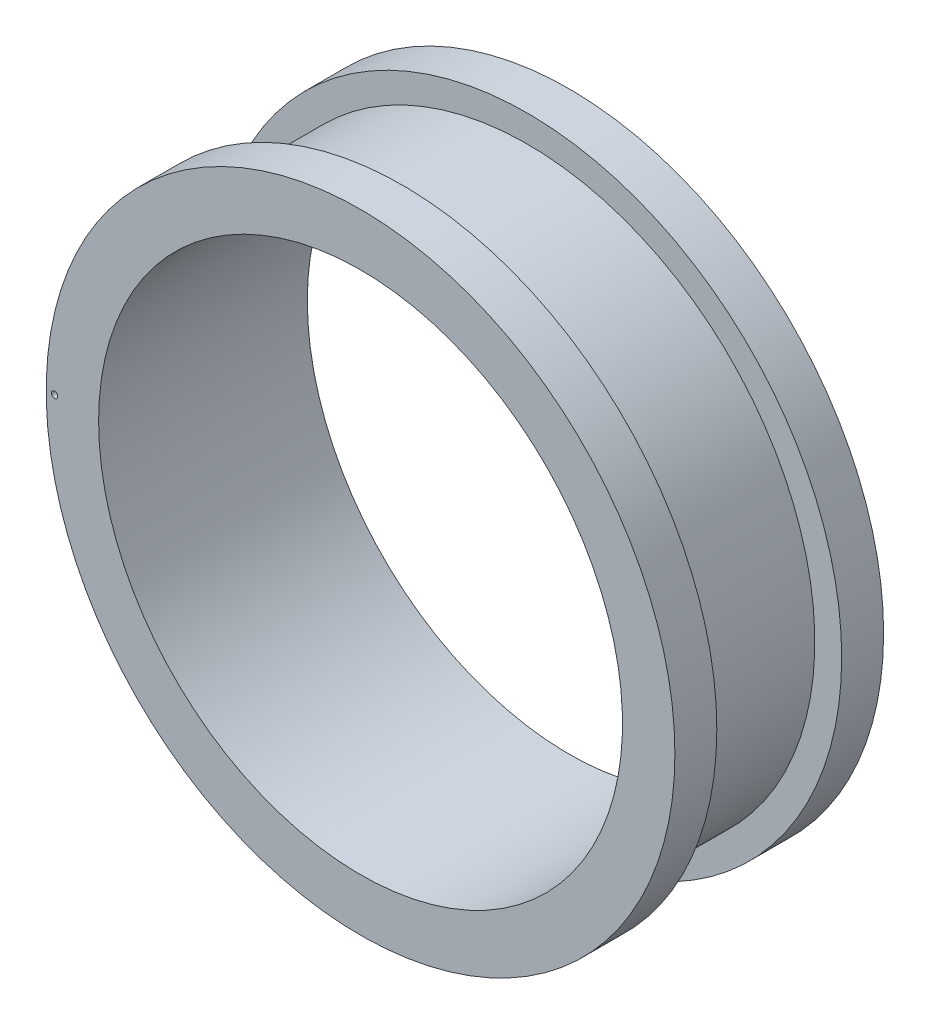
ISO-10303-21;
HEADER;
FILE_DESCRIPTION(('STEP AP214'),'2;1');
FILE_NAME('part.step','',(''),(''),'','','');
FILE_SCHEMA(('AUTOMOTIVE_DESIGN { 1 0 10303 214 1 1 1 1 }'));
ENDSEC;
DATA;
#1=APPLICATION_CONTEXT('core data for automotive mechanical design processes');
#2=APPLICATION_PROTOCOL_DEFINITION('international standard','automotive_design',2000,#1);
#3=PRODUCT_CONTEXT('',#1,'mechanical');
#4=PRODUCT('Part','Part','',(#3));
#5=PRODUCT_RELATED_PRODUCT_CATEGORY('part','',(#4));
#6=PRODUCT_DEFINITION_FORMATION('','',#4);
#7=PRODUCT_DEFINITION_CONTEXT('part definition',#1,'design');
#8=PRODUCT_DEFINITION('design','',#6,#7);
#9=PRODUCT_DEFINITION_SHAPE('','',#8);
#10=(LENGTH_UNIT() NAMED_UNIT(*) SI_UNIT(.MILLI.,.METRE.));
#11=(NAMED_UNIT(*) PLANE_ANGLE_UNIT() SI_UNIT($,.RADIAN.));
#12=(NAMED_UNIT(*) SI_UNIT($,.STERADIAN.) SOLID_ANGLE_UNIT());
#13=UNCERTAINTY_MEASURE_WITH_UNIT(LENGTH_MEASURE(1.E-05),#10,'distance_accuracy_value','');
#14=(GEOMETRIC_REPRESENTATION_CONTEXT(3) GLOBAL_UNCERTAINTY_ASSIGNED_CONTEXT((#13)) GLOBAL_UNIT_ASSIGNED_CONTEXT((#10,
#11,#12)) REPRESENTATION_CONTEXT('',''));
#15=CARTESIAN_POINT('',(0.,0.,0.));
#16=DIRECTION('',(0.,0.,1.));
#17=DIRECTION('',(1.,0.,0.));
#18=AXIS2_PLACEMENT_3D('',#15,#16,#17);
#19=CARTESIAN_POINT('',(0.,0.,-20.));
#20=DIRECTION('',(0.,0.,1.));
#21=DIRECTION('',(1.,0.,0.));
#22=AXIS2_PLACEMENT_3D('',#19,#20,#21);
#23=CYLINDRICAL_SURFACE('',#22,150.);
#24=CARTESIAN_POINT('',(0.,0.,-20.));
#25=DIRECTION('',(0.,0.,1.));
#26=DIRECTION('',(1.,0.,0.));
#27=AXIS2_PLACEMENT_3D('',#24,#25,#26);
#28=CIRCLE('',#27,150.);
#29=CARTESIAN_POINT('',(150.,0.,-20.));
#30=VERTEX_POINT('',#29);
#31=EDGE_CURVE('E42',#30,#30,#28,.T.);
#32=ORIENTED_EDGE('',*,*,#31,.T.);
#33=EDGE_LOOP('',(#32));
#34=FACE_BOUND('',#33,.T.);
#35=CARTESIAN_POINT('',(0.,0.,0.));
#36=DIRECTION('',(0.,0.,1.));
#37=DIRECTION('',(1.,0.,0.));
#38=AXIS2_PLACEMENT_3D('',#35,#36,#37);
#39=CIRCLE('',#38,150.);
#40=CARTESIAN_POINT('',(150.,0.,0.));
#41=VERTEX_POINT('',#40);
#42=EDGE_CURVE('E37',#41,#41,#39,.T.);
#43=ORIENTED_EDGE('',*,*,#42,.F.);
#44=EDGE_LOOP('',(#43));
#45=FACE_BOUND('',#44,.T.);
#46=ADVANCED_FACE('F40',(#34,#45),#23,.T.);
#47=CARTESIAN_POINT('',(0.,0.,-20.));
#48=DIRECTION('',(0.,0.,1.));
#49=DIRECTION('',(1.,0.,0.));
#50=AXIS2_PLACEMENT_3D('',#47,#48,#49);
#51=PLANE('',#50);
#52=CARTESIAN_POINT('',(0.,0.,-20.));
#53=DIRECTION('',(0.,0.,-1.));
#54=DIRECTION('',(-1.,0.,0.));
#55=AXIS2_PLACEMENT_3D('',#52,#53,#54);
#56=CIRCLE('',#55,125.);
#57=CARTESIAN_POINT('',(-125.,0.,-20.));
#58=VERTEX_POINT('',#57);
#59=EDGE_CURVE('E52',#58,#58,#56,.T.);
#60=ORIENTED_EDGE('',*,*,#59,.F.);
#61=EDGE_LOOP('',(#60));
#62=FACE_BOUND('',#61,.T.);
#63=ORIENTED_EDGE('',*,*,#31,.F.);
#64=EDGE_LOOP('',(#63));
#65=FACE_BOUND('',#64,.T.);
#66=ADVANCED_FACE('F105',(#62,#65),#51,.F.);
#67=CARTESIAN_POINT('',(0.,0.,0.));
#68=DIRECTION('',(0.,0.,1.));
#69=DIRECTION('',(1.,0.,0.));
#70=AXIS2_PLACEMENT_3D('',#67,#68,#69);
#71=PLANE('',#70);
#72=CARTESIAN_POINT('',(0.,0.,0.));
#73=DIRECTION('',(0.,0.,1.));
#74=DIRECTION('',(1.,0.,0.));
#75=AXIS2_PLACEMENT_3D('',#72,#73,#74);
#76=CIRCLE('',#75,137.171463505457);
#77=CARTESIAN_POINT('',(-137.171463505457,0.,0.));
#78=VERTEX_POINT('',#77);
#79=EDGE_CURVE('E10',#78,#78,#76,.T.);
#80=ORIENTED_EDGE('',*,*,#79,.F.);
#81=EDGE_LOOP('',(#80));
#82=FACE_BOUND('',#81,.T.);
#83=ORIENTED_EDGE('',*,*,#42,.T.);
#84=EDGE_LOOP('',(#83));
#85=FACE_BOUND('',#84,.T.);
#86=ADVANCED_FACE('F92',(#82,#85),#71,.T.);
#87=CARTESIAN_POINT('',(0.,0.,0.001000000000001));
#88=DIRECTION('',(0.,0.,-1.));
#89=DIRECTION('',(-1.,0.,0.));
#90=AXIS2_PLACEMENT_3D('',#87,#88,#89);
#91=CYLINDRICAL_SURFACE('',#90,125.);
#92=CARTESIAN_POINT('',(0.,0.,79.5888553513194));
#93=DIRECTION('',(0.,0.,-1.));
#94=DIRECTION('',(-1.,0.,0.));
#95=AXIS2_PLACEMENT_3D('',#92,#93,#94);
#96=CIRCLE('',#95,125.);
#97=CARTESIAN_POINT('',(-125.,0.,79.5888553513194));
#98=VERTEX_POINT('',#97);
#99=EDGE_CURVE('E67',#98,#98,#96,.T.);
#100=CARTESIAN_POINT('',(-125.,0.,-20.));
#101=CARTESIAN_POINT('',(-125.,0.,-18.9626160900904));
#102=CARTESIAN_POINT('',(-125.,0.,-17.9252321801808));
#103=CARTESIAN_POINT('',(-125.,0.,-15.8504643603617));
#104=CARTESIAN_POINT('',(-125.,0.,-14.8130804504521));
#105=CARTESIAN_POINT('',(-125.,0.,-12.738312630633));
#106=CARTESIAN_POINT('',(-125.,0.,-11.7009287207234));
#107=CARTESIAN_POINT('',(-125.,0.,-9.62616090090423));
#108=CARTESIAN_POINT('',(-125.,0.,-8.58877699099466));
#109=CARTESIAN_POINT('',(-125.,0.,-6.5140091711755));
#110=CARTESIAN_POINT('',(-125.,0.,-5.47662526126593));
#111=CARTESIAN_POINT('',(-125.,0.,-3.40185744144677));
#112=CARTESIAN_POINT('',(-125.,0.,-2.3644735315372));
#113=CARTESIAN_POINT('',(-125.,0.,-0.289705711718043));
#114=CARTESIAN_POINT('',(-125.,0.,0.747678198191534));
#115=CARTESIAN_POINT('',(-125.,0.,2.82244601801069));
#116=CARTESIAN_POINT('',(-125.,0.,3.85982992792026));
#117=CARTESIAN_POINT('',(-125.,0.,5.93459774773942));
#118=CARTESIAN_POINT('',(-125.,0.,6.97198165764899));
#119=CARTESIAN_POINT('',(-125.,0.,9.04674947746815));
#120=CARTESIAN_POINT('',(-125.,0.,10.0841333873777));
#121=CARTESIAN_POINT('',(-125.,0.,12.1589012071969));
#122=CARTESIAN_POINT('',(-125.,0.,13.1962851171065));
#123=CARTESIAN_POINT('',(-125.,0.,15.2710529369256));
#124=CARTESIAN_POINT('',(-125.,0.,16.3084368468352));
#125=CARTESIAN_POINT('',(-125.,0.,18.3832046666543));
#126=CARTESIAN_POINT('',(-125.,0.,19.4205885765639));
#127=CARTESIAN_POINT('',(-125.,0.,21.4953563963831));
#128=CARTESIAN_POINT('',(-125.,0.,22.5327403062926));
#129=CARTESIAN_POINT('',(-125.,0.,24.6075081261118));
#130=CARTESIAN_POINT('',(-125.,0.,25.6448920360214));
#131=CARTESIAN_POINT('',(-125.,0.,27.7196598558405));
#132=CARTESIAN_POINT('',(-125.,0.,28.7570437657501));
#133=CARTESIAN_POINT('',(-125.,0.,30.8318115855693));
#134=CARTESIAN_POINT('',(-125.,0.,31.8691954954788));
#135=CARTESIAN_POINT('',(-125.,0.,33.943963315298));
#136=CARTESIAN_POINT('',(-125.,0.,34.9813472252076));
#137=CARTESIAN_POINT('',(-125.,0.,37.0561150450267));
#138=CARTESIAN_POINT('',(-125.,0.,38.0934989549363));
#139=CARTESIAN_POINT('',(-125.,0.,40.1682667747555));
#140=CARTESIAN_POINT('',(-125.,0.,41.205650684665));
#141=CARTESIAN_POINT('',(-125.,0.,43.2804185044842));
#142=CARTESIAN_POINT('',(-125.,0.,44.3178024143938));
#143=CARTESIAN_POINT('',(-125.,0.,46.3925702342129));
#144=CARTESIAN_POINT('',(-125.,0.,47.4299541441225));
#145=CARTESIAN_POINT('',(-125.,0.,49.5047219639416));
#146=CARTESIAN_POINT('',(-125.,0.,50.5421058738512));
#147=CARTESIAN_POINT('',(-125.,0.,52.6168736936704));
#148=CARTESIAN_POINT('',(-125.,0.,53.6542576035799));
#149=CARTESIAN_POINT('',(-125.,0.,55.7290254233991));
#150=CARTESIAN_POINT('',(-125.,0.,56.7664093333087));
#151=CARTESIAN_POINT('',(-125.,0.,58.8411771531278));
#152=CARTESIAN_POINT('',(-125.,0.,59.8785610630374));
#153=CARTESIAN_POINT('',(-125.,0.,61.9533288828566));
#154=CARTESIAN_POINT('',(-125.,0.,62.9907127927661));
#155=CARTESIAN_POINT('',(-125.,0.,65.0654806125853));
#156=CARTESIAN_POINT('',(-125.,0.,66.1028645224949));
#157=CARTESIAN_POINT('',(-125.,0.,68.177632342314));
#158=CARTESIAN_POINT('',(-125.,0.,69.2150162522236));
#159=CARTESIAN_POINT('',(-125.,0.,71.2897840720427));
#160=CARTESIAN_POINT('',(-125.,0.,72.3271679819523));
#161=CARTESIAN_POINT('',(-125.,0.,74.4019358017715));
#162=CARTESIAN_POINT('',(-125.,0.,75.4393197116811));
#163=CARTESIAN_POINT('',(-125.,0.,77.5140875315002));
#164=CARTESIAN_POINT('',(-125.,0.,78.5514714414098));
#165=CARTESIAN_POINT('',(-125.,0.,79.5888553513194));
#166=B_SPLINE_CURVE_WITH_KNOTS('',3,(#100,#101,#102,#103,#104,#105,#106,#107,#108,#109,#110,
#111,#112,#113,#114,#115,#116,#117,#118,#119,#120,#121,#122,#123,#124,#125,#126,#127,#128,#129,
#130,#131,#132,#133,#134,#135,#136,#137,#138,#139,#140,#141,#142,#143,#144,#145,#146,#147,#148,
#149,#150,#151,#152,#153,#154,#155,#156,#157,#158,#159,#160,#161,#162,#163,#164,#165),
.UNSPECIFIED.,.F.,.F.,(4,2,2,2,2,2,2,2,2,2,2,2,2,2,2,2,2,2,2,2,2,2,2,2,2,2,2,2,2,2,2,2,4),(0.,
3.11215172972873,6.22430345945746,9.33645518918619,12.4486069189149,15.5607586486437,
18.6729103783724,21.7850621081011,24.8972138378298,28.0093655675586,31.1215172972873,
34.233669027016,37.3458207567448,40.4579724864735,43.5701242162022,46.682275945931,
49.7944276756597,52.9065794053884,56.0187311351171,59.1308828648459,62.2430345945746,
65.3551863243033,68.4673380540321,71.5794897837608,74.6916415134895,77.8037932432183,
80.915944972947,84.0280967026757,87.1402484324044,90.2524001621332,93.3645518918619,
96.4767036215906,99.5888553513194),.UNSPECIFIED.);
#167=EDGE_CURVE('BSEAM88',#58,#98,#166,.T.);
#168=ORIENTED_EDGE('',*,*,#59,.T.);
#169=ORIENTED_EDGE('',*,*,#99,.F.);
#170=ORIENTED_EDGE('',*,*,#167,.T.);
#171=ORIENTED_EDGE('',*,*,#167,.F.);
#172=EDGE_LOOP('',(#168,#170,#169,#171));
#173=FACE_BOUND('',#172,.T.);
#174=ADVANCED_FACE('F88',(#173),#91,.F.);
#175=CARTESIAN_POINT('',(0.,0.,59.5888553513193));
#176=DIRECTION('',(0.,0.,-1.));
#177=DIRECTION('',(-1.,0.,0.));
#178=AXIS2_PLACEMENT_3D('',#175,#176,#177);
#179=CYLINDRICAL_SURFACE('',#178,137.171463505457);
#180=CARTESIAN_POINT('',(0.,0.,59.5888553513193));
#181=DIRECTION('',(0.,0.,1.));
#182=DIRECTION('',(1.,0.,0.));
#183=AXIS2_PLACEMENT_3D('',#180,#181,#182);
#184=CIRCLE('',#183,137.171463505457);
#185=CARTESIAN_POINT('',(-137.171463505457,0.,59.5888553513193));
#186=VERTEX_POINT('',#185);
#187=EDGE_CURVE('E51',#186,#186,#184,.T.);
#188=CARTESIAN_POINT('',(-137.171463505457,0.,59.5888553513193));
#189=CARTESIAN_POINT('',(-137.171463505457,0.,58.9681381080764));
#190=CARTESIAN_POINT('',(-137.171463505457,0.,58.3474208648335));
#191=CARTESIAN_POINT('',(-137.171463505457,0.,57.1059863783477));
#192=CARTESIAN_POINT('',(-137.171463505457,0.,56.4852691351048));
#193=CARTESIAN_POINT('',(-137.171463505457,0.,55.243834648619));
#194=CARTESIAN_POINT('',(-137.171463505457,0.,54.6231174053761));
#195=CARTESIAN_POINT('',(-137.171463505457,0.,53.3816829188902));
#196=CARTESIAN_POINT('',(-137.171463505457,0.,52.7609656756473));
#197=CARTESIAN_POINT('',(-137.171463505457,0.,51.5195311891615));
#198=CARTESIAN_POINT('',(-137.171463505457,0.,50.8988139459186));
#199=CARTESIAN_POINT('',(-137.171463505457,0.,49.6573794594328));
#200=CARTESIAN_POINT('',(-137.171463505457,0.,49.0366622161899));
#201=CARTESIAN_POINT('',(-137.171463505457,0.,47.7952277297041));
#202=CARTESIAN_POINT('',(-137.171463505457,0.,47.1745104864611));
#203=CARTESIAN_POINT('',(-137.171463505457,0.,45.9330759999753));
#204=CARTESIAN_POINT('',(-137.171463505457,0.,45.3123587567324));
#205=CARTESIAN_POINT('',(-137.171463505457,0.,44.0709242702466));
#206=CARTESIAN_POINT('',(-137.171463505457,0.,43.4502070270037));
#207=CARTESIAN_POINT('',(-137.171463505457,0.,42.2087725405179));
#208=CARTESIAN_POINT('',(-137.171463505457,0.,41.588055297275));
#209=CARTESIAN_POINT('',(-137.171463505457,0.,40.3466208107891));
#210=CARTESIAN_POINT('',(-137.171463505457,0.,39.7259035675462));
#211=CARTESIAN_POINT('',(-137.171463505457,0.,38.4844690810604));
#212=CARTESIAN_POINT('',(-137.171463505457,0.,37.8637518378175));
#213=CARTESIAN_POINT('',(-137.171463505457,0.,36.6223173513317));
#214=CARTESIAN_POINT('',(-137.171463505457,0.,36.0016001080888));
#215=CARTESIAN_POINT('',(-137.171463505457,0.,34.7601656216029));
#216=CARTESIAN_POINT('',(-137.171463505457,0.,34.13944837836));
#217=CARTESIAN_POINT('',(-137.171463505457,0.,32.8980138918742));
#218=CARTESIAN_POINT('',(-137.171463505457,0.,32.2772966486313));
#219=CARTESIAN_POINT('',(-137.171463505457,0.,31.0358621621455));
#220=CARTESIAN_POINT('',(-137.171463505457,0.,30.4151449189026));
#221=CARTESIAN_POINT('',(-137.171463505457,0.,29.1737104324168));
#222=CARTESIAN_POINT('',(-137.171463505457,0.,28.5529931891739));
#223=CARTESIAN_POINT('',(-137.171463505457,0.,27.311558702688));
#224=CARTESIAN_POINT('',(-137.171463505457,0.,26.6908414594451));
#225=CARTESIAN_POINT('',(-137.171463505457,0.,25.4494069729593));
#226=CARTESIAN_POINT('',(-137.171463505457,0.,24.8286897297164));
#227=CARTESIAN_POINT('',(-137.171463505457,0.,23.5872552432306));
#228=CARTESIAN_POINT('',(-137.171463505457,0.,22.9665379999877));
#229=CARTESIAN_POINT('',(-137.171463505457,0.,21.7251035135018));
#230=CARTESIAN_POINT('',(-137.171463505457,0.,21.1043862702589));
#231=CARTESIAN_POINT('',(-137.171463505457,0.,19.8629517837731));
#232=CARTESIAN_POINT('',(-137.171463505457,0.,19.2422345405302));
#233=CARTESIAN_POINT('',(-137.171463505457,0.,18.0008000540444));
#234=CARTESIAN_POINT('',(-137.171463505457,0.,17.3800828108015));
#235=CARTESIAN_POINT('',(-137.171463505457,0.,16.1386483243157));
#236=CARTESIAN_POINT('',(-137.171463505457,0.,15.5179310810727));
#237=CARTESIAN_POINT('',(-137.171463505457,0.,14.2764965945869));
#238=CARTESIAN_POINT('',(-137.171463505457,0.,13.655779351344));
#239=CARTESIAN_POINT('',(-137.171463505457,0.,12.4143448648582));
#240=CARTESIAN_POINT('',(-137.171463505457,0.,11.7936276216153));
#241=CARTESIAN_POINT('',(-137.171463505457,0.,10.5521931351295));
#242=CARTESIAN_POINT('',(-137.171463505457,0.,9.93147589188655));
#243=CARTESIAN_POINT('',(-137.171463505457,0.,8.69004140540073));
#244=CARTESIAN_POINT('',(-137.171463505457,0.,8.06932416215782));
#245=CARTESIAN_POINT('',(-137.171463505457,0.,6.827889675672));
#246=CARTESIAN_POINT('',(-137.171463505457,0.,6.20717243242909));
#247=CARTESIAN_POINT('',(-137.171463505457,0.,4.96573794594327));
#248=CARTESIAN_POINT('',(-137.171463505457,0.,4.34502070270036));
#249=CARTESIAN_POINT('',(-137.171463505457,0.,3.10358621621454));
#250=CARTESIAN_POINT('',(-137.171463505457,0.,2.48286897297163));
#251=CARTESIAN_POINT('',(-137.171463505457,0.,1.24143448648581));
#252=CARTESIAN_POINT('',(-137.171463505457,0.,0.620717243242903));
#253=CARTESIAN_POINT('',(-137.171463505457,0.,0.));
#254=B_SPLINE_CURVE_WITH_KNOTS('',3,(#188,#189,#190,#191,#192,#193,#194,#195,#196,#197,#198,
#199,#200,#201,#202,#203,#204,#205,#206,#207,#208,#209,#210,#211,#212,#213,#214,#215,#216,#217,
#218,#219,#220,#221,#222,#223,#224,#225,#226,#227,#228,#229,#230,#231,#232,#233,#234,#235,#236,
#237,#238,#239,#240,#241,#242,#243,#244,#245,#246,#247,#248,#249,#250,#251,#252,#253),
.UNSPECIFIED.,.F.,.F.,(4,2,2,2,2,2,2,2,2,2,2,2,2,2,2,2,2,2,2,2,2,2,2,2,2,2,2,2,2,2,2,2,4),(0.,
1.86215172972873,3.72430345945746,5.58645518918618,7.44860691891491,9.31075864864364,
11.1729103783724,13.0350621081011,14.8972138378298,16.7593655675586,18.6215172972873,
20.483669027016,22.3458207567447,24.2079724864735,26.0701242162022,27.9322759459309,
29.7944276756597,31.6565794053884,33.5187311351171,35.3808828648459,37.2430345945746,
39.1051863243033,40.967338054032,42.8294897837608,44.6916415134895,46.5537932432182,
48.415944972947,50.2780967026757,52.1402484324044,54.0024001621332,55.8645518918619,
57.7267036215906,59.5888553513193),.UNSPECIFIED.);
#255=EDGE_CURVE('BSEAM94',#186,#78,#254,.T.);
#256=ORIENTED_EDGE('',*,*,#187,.F.);
#257=ORIENTED_EDGE('',*,*,#79,.T.);
#258=ORIENTED_EDGE('',*,*,#255,.T.);
#259=ORIENTED_EDGE('',*,*,#255,.F.);
#260=EDGE_LOOP('',(#256,#258,#257,#259));
#261=FACE_BOUND('',#260,.T.);
#262=ADVANCED_FACE('F94',(#261),#179,.T.);
#263=CARTESIAN_POINT('',(0.,0.,79.5888553513194));
#264=DIRECTION('',(0.,0.,-1.));
#265=DIRECTION('',(-1.,0.,0.));
#266=AXIS2_PLACEMENT_3D('',#263,#264,#265);
#267=CYLINDRICAL_SURFACE('',#266,150.);
#268=CARTESIAN_POINT('',(0.,0.,79.5888553513194));
#269=DIRECTION('',(0.,0.,1.));
#270=DIRECTION('',(1.,0.,0.));
#271=AXIS2_PLACEMENT_3D('',#268,#269,#270);
#272=CIRCLE('',#271,150.);
#273=CARTESIAN_POINT('',(150.,0.,79.5888553513194));
#274=VERTEX_POINT('',#273);
#275=EDGE_CURVE('E56',#274,#274,#272,.T.);
#276=ORIENTED_EDGE('',*,*,#275,.F.);
#277=EDGE_LOOP('',(#276));
#278=FACE_BOUND('',#277,.T.);
#279=CARTESIAN_POINT('',(0.,0.,59.5888553513193));
#280=DIRECTION('',(0.,0.,1.));
#281=DIRECTION('',(1.,0.,0.));
#282=AXIS2_PLACEMENT_3D('',#279,#280,#281);
#283=CIRCLE('',#282,150.);
#284=CARTESIAN_POINT('',(150.,0.,59.5888553513193));
#285=VERTEX_POINT('',#284);
#286=EDGE_CURVE('E64',#285,#285,#283,.T.);
#287=ORIENTED_EDGE('',*,*,#286,.T.);
#288=EDGE_LOOP('',(#287));
#289=FACE_BOUND('',#288,.T.);
#290=ADVANCED_FACE('F87',(#278,#289),#267,.T.);
#291=CARTESIAN_POINT('',(0.,0.,79.5888553513194));
#292=DIRECTION('',(0.,0.,1.));
#293=DIRECTION('',(1.,0.,0.));
#294=AXIS2_PLACEMENT_3D('',#291,#292,#293);
#295=PLANE('',#294);
#296=CARTESIAN_POINT('',(-145.990171569486,0.381304843150494,79.5888553513194));
#297=DIRECTION('',(0.,0.,1.));
#298=DIRECTION('',(1.,0.,0.));
#299=AXIS2_PLACEMENT_3D('',#296,#297,#298);
#300=CIRCLE('',#299,1.5);
#301=CARTESIAN_POINT('',(-144.490171569486,0.381304843150494,79.5888553513194));
#302=VERTEX_POINT('',#301);
#303=EDGE_CURVE('E74',#302,#302,#300,.T.);
#304=ORIENTED_EDGE('',*,*,#303,.F.);
#305=EDGE_LOOP('',(#304));
#306=FACE_BOUND('',#305,.T.);
#307=ORIENTED_EDGE('',*,*,#99,.T.);
#308=EDGE_LOOP('',(#307));
#309=FACE_BOUND('',#308,.T.);
#310=ORIENTED_EDGE('',*,*,#275,.T.);
#311=EDGE_LOOP('',(#310));
#312=FACE_BOUND('',#311,.T.);
#313=ADVANCED_FACE('F85',(#306,#309,#312),#295,.T.);
#314=CARTESIAN_POINT('',(0.,0.,59.5888553513193));
#315=DIRECTION('',(0.,0.,1.));
#316=DIRECTION('',(1.,0.,0.));
#317=AXIS2_PLACEMENT_3D('',#314,#315,#316);
#318=PLANE('',#317);
#319=CARTESIAN_POINT('',(-145.990171569486,0.381304843150494,59.5888553513193));
#320=DIRECTION('',(0.,0.,1.));
#321=DIRECTION('',(1.,0.,0.));
#322=AXIS2_PLACEMENT_3D('',#319,#320,#321);
#323=CIRCLE('',#322,1.5);
#324=CARTESIAN_POINT('',(-144.490171569486,0.381304843150494,59.5888553513193));
#325=VERTEX_POINT('',#324);
#326=EDGE_CURVE('E75',#325,#325,#323,.F.);
#327=ORIENTED_EDGE('',*,*,#326,.F.);
#328=EDGE_LOOP('',(#327));
#329=FACE_BOUND('',#328,.T.);
#330=ORIENTED_EDGE('',*,*,#187,.T.);
#331=EDGE_LOOP('',(#330));
#332=FACE_BOUND('',#331,.T.);
#333=ORIENTED_EDGE('',*,*,#286,.F.);
#334=EDGE_LOOP('',(#333));
#335=FACE_BOUND('',#334,.T.);
#336=ADVANCED_FACE('F83',(#329,#332,#335),#318,.F.);
#337=CARTESIAN_POINT('',(-145.990171569486,0.381304843150494,-20.001));
#338=DIRECTION('',(0.,0.,1.));
#339=DIRECTION('',(1.,0.,0.));
#340=AXIS2_PLACEMENT_3D('',#337,#338,#339);
#341=CYLINDRICAL_SURFACE('',#340,1.5);
#342=ORIENTED_EDGE('',*,*,#303,.T.);
#343=EDGE_LOOP('',(#342));
#344=FACE_BOUND('',#343,.T.);
#345=ORIENTED_EDGE('',*,*,#326,.T.);
#346=EDGE_LOOP('',(#345));
#347=FACE_BOUND('',#346,.T.);
#348=ADVANCED_FACE('F79',(#344,#347),#341,.F.);
#349=CLOSED_SHELL('',(#46,#66,#86,#174,#262,#290,#313,#336,#348));
#350=MANIFOLD_SOLID_BREP('B2',#349);
#351=ADVANCED_BREP_SHAPE_REPRESENTATION('',(#18,#350),#14);
#352=SHAPE_DEFINITION_REPRESENTATION(#9,#351);
ENDSEC;
END-ISO-10303-21;
